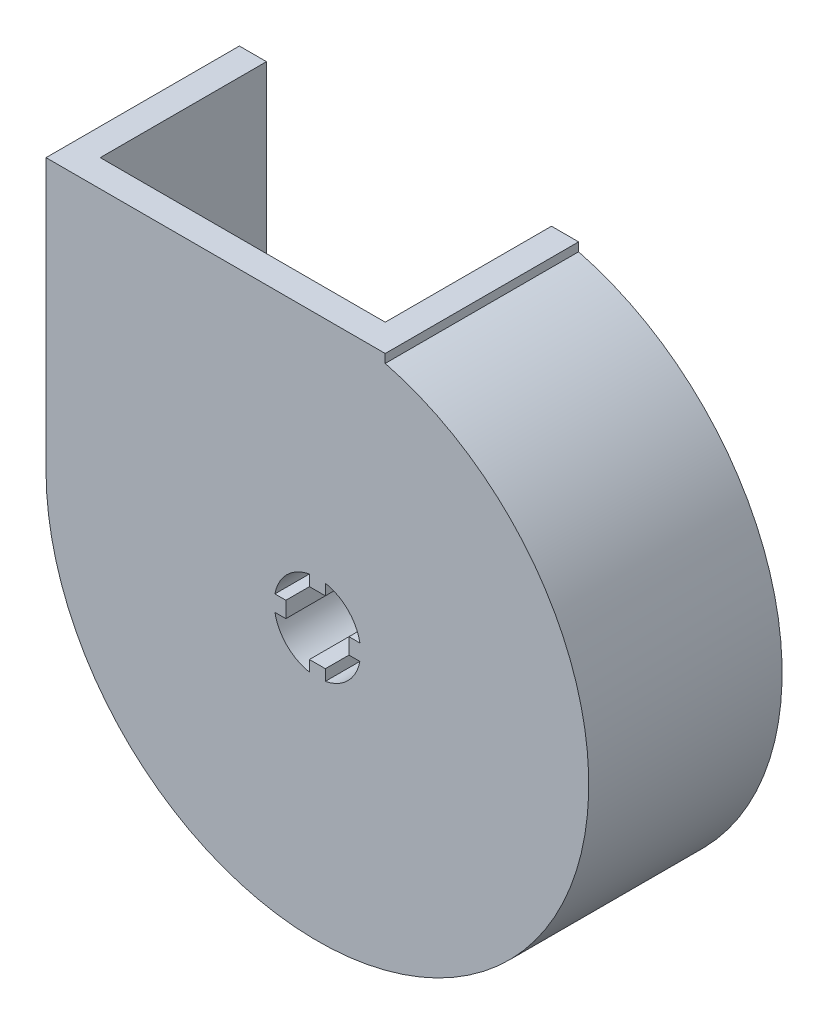
ISO-10303-21;
HEADER;
FILE_DESCRIPTION(('STEP AP214'),'2;1');
FILE_NAME('part.step','',(''),(''),'','','');
FILE_SCHEMA(('AUTOMOTIVE_DESIGN { 1 0 10303 214 1 1 1 1 }'));
ENDSEC;
DATA;
#1=APPLICATION_CONTEXT('core data for automotive mechanical design processes');
#2=APPLICATION_PROTOCOL_DEFINITION('international standard','automotive_design',2000,#1);
#3=PRODUCT_CONTEXT('',#1,'mechanical');
#4=PRODUCT('Part','Part','',(#3));
#5=PRODUCT_RELATED_PRODUCT_CATEGORY('part','',(#4));
#6=PRODUCT_DEFINITION_FORMATION('','',#4);
#7=PRODUCT_DEFINITION_CONTEXT('part definition',#1,'design');
#8=PRODUCT_DEFINITION('design','',#6,#7);
#9=PRODUCT_DEFINITION_SHAPE('','',#8);
#10=(LENGTH_UNIT() NAMED_UNIT(*) SI_UNIT(.MILLI.,.METRE.));
#11=(NAMED_UNIT(*) PLANE_ANGLE_UNIT() SI_UNIT($,.RADIAN.));
#12=(NAMED_UNIT(*) SI_UNIT($,.STERADIAN.) SOLID_ANGLE_UNIT());
#13=UNCERTAINTY_MEASURE_WITH_UNIT(LENGTH_MEASURE(1.E-05),#10,'distance_accuracy_value','');
#14=(GEOMETRIC_REPRESENTATION_CONTEXT(3) GLOBAL_UNCERTAINTY_ASSIGNED_CONTEXT((#13)) GLOBAL_UNIT_ASSIGNED_CONTEXT((#10,
#11,#12)) REPRESENTATION_CONTEXT('',''));
#15=CARTESIAN_POINT('',(0.,0.,0.));
#16=DIRECTION('',(0.,0.,1.));
#17=DIRECTION('',(1.,0.,0.));
#18=AXIS2_PLACEMENT_3D('',#15,#16,#17);
#19=CARTESIAN_POINT('',(0.,0.,0.));
#20=DIRECTION('',(0.,0.,-1.));
#21=DIRECTION('',(-1.,0.,0.));
#22=AXIS2_PLACEMENT_3D('',#19,#20,#21);
#23=PLANE('',#22);
#24=CARTESIAN_POINT('',(0.,0.,0.));
#25=DIRECTION('',(0.,0.,-1.));
#26=DIRECTION('',(-1.,0.,0.));
#27=AXIS2_PLACEMENT_3D('',#24,#25,#26);
#28=CIRCLE('',#27,72.01);
#29=CARTESIAN_POINT('',(12.01,71.0014084367346,0.));
#30=VERTEX_POINT('',#29);
#31=CARTESIAN_POINT('',(-72.01,0.,0.));
#32=VERTEX_POINT('',#31);
#33=EDGE_CURVE('E407',#30,#32,#28,.T.);
#34=ORIENTED_EDGE('',*,*,#33,.F.);
#35=DIRECTION('',(0.,-1.,0.));
#36=VECTOR('',#35,1.);
#37=CARTESIAN_POINT('',(12.01,0.,0.));
#38=LINE('',#37,#36);
#39=CARTESIAN_POINT('',(12.01,80.,0.));
#40=VERTEX_POINT('',#39);
#41=EDGE_CURVE('E404',#40,#30,#38,.T.);
#42=ORIENTED_EDGE('',*,*,#41,.F.);
#43=DIRECTION('',(-1.,0.,0.));
#44=VECTOR('',#43,1.);
#45=CARTESIAN_POINT('',(0.,80.,0.));
#46=LINE('',#45,#44);
#47=CARTESIAN_POINT('',(20.,80.,0.));
#48=VERTEX_POINT('',#47);
#49=EDGE_CURVE('E412',#48,#40,#46,.T.);
#50=ORIENTED_EDGE('',*,*,#49,.F.);
#51=DIRECTION('',(0.,-1.,0.));
#52=VECTOR('',#51,1.);
#53=CARTESIAN_POINT('',(20.,0.,0.));
#54=LINE('',#53,#52);
#55=CARTESIAN_POINT('',(20.,77.4596669241483,0.));
#56=VERTEX_POINT('',#55);
#57=EDGE_CURVE('E419',#48,#56,#54,.T.);
#58=ORIENTED_EDGE('',*,*,#57,.T.);
#59=CARTESIAN_POINT('',(0.,0.,0.));
#60=DIRECTION('',(0.,0.,-1.));
#61=DIRECTION('',(-1.,0.,0.));
#62=AXIS2_PLACEMENT_3D('',#59,#60,#61);
#63=CIRCLE('',#62,80.);
#64=CARTESIAN_POINT('',(-80.,0.,0.));
#65=VERTEX_POINT('',#64);
#66=EDGE_CURVE('E233',#56,#65,#63,.T.);
#67=ORIENTED_EDGE('',*,*,#66,.T.);
#68=DIRECTION('',(0.,-1.,0.));
#69=VECTOR('',#68,1.);
#70=CARTESIAN_POINT('',(-80.,0.,0.));
#71=LINE('',#70,#69);
#72=CARTESIAN_POINT('',(-80.,80.,0.));
#73=VERTEX_POINT('',#72);
#74=EDGE_CURVE('E330',#73,#65,#71,.T.);
#75=ORIENTED_EDGE('',*,*,#74,.F.);
#76=CARTESIAN_POINT('',(-72.01,80.,0.));
#77=VERTEX_POINT('',#76);
#78=EDGE_CURVE('E411',#77,#73,#46,.T.);
#79=ORIENTED_EDGE('',*,*,#78,.F.);
#80=DIRECTION('',(0.,-1.,0.));
#81=VECTOR('',#80,1.);
#82=CARTESIAN_POINT('',(-72.01,0.,0.));
#83=LINE('',#82,#81);
#84=EDGE_CURVE('E415',#77,#32,#83,.T.);
#85=ORIENTED_EDGE('',*,*,#84,.T.);
#86=EDGE_LOOP('',(#34,#42,#50,#58,#67,#75,#79,#85));
#87=FACE_BOUND('',#86,.T.);
#88=ADVANCED_FACE('F45',(#87),#23,.T.);
#89=CARTESIAN_POINT('',(0.,0.,0.));
#90=DIRECTION('',(0.,0.,-1.));
#91=DIRECTION('',(-1.,0.,0.));
#92=AXIS2_PLACEMENT_3D('',#89,#90,#91);
#93=CIRCLE('',#92,12.75);
#94=CARTESIAN_POINT('',(12.5315601582564,2.35,0.));
#95=VERTEX_POINT('',#94);
#96=CARTESIAN_POINT('',(2.35,12.5315601582564,0.));
#97=VERTEX_POINT('',#96);
#98=EDGE_CURVE('E231',#95,#97,#93,.F.);
#99=ORIENTED_EDGE('',*,*,#98,.T.);
#100=DIRECTION('',(0.,-1.,0.));
#101=VECTOR('',#100,1.);
#102=CARTESIAN_POINT('',(2.35,9.3,0.));
#103=LINE('',#102,#101);
#104=CARTESIAN_POINT('',(2.35,9.3,0.));
#105=VERTEX_POINT('',#104);
#106=EDGE_CURVE('E211',#97,#105,#103,.T.);
#107=ORIENTED_EDGE('',*,*,#106,.T.);
#108=DIRECTION('',(-1.,0.,0.));
#109=VECTOR('',#108,1.);
#110=CARTESIAN_POINT('',(-2.35,9.3,0.));
#111=LINE('',#110,#109);
#112=CARTESIAN_POINT('',(-2.35,9.3,0.));
#113=VERTEX_POINT('',#112);
#114=EDGE_CURVE('E228',#105,#113,#111,.T.);
#115=ORIENTED_EDGE('',*,*,#114,.T.);
#116=DIRECTION('',(0.,1.,0.));
#117=VECTOR('',#116,1.);
#118=CARTESIAN_POINT('',(-2.35,12.5315601582564,0.));
#119=LINE('',#118,#117);
#120=CARTESIAN_POINT('',(-2.35,12.5315601582564,0.));
#121=VERTEX_POINT('',#120);
#122=EDGE_CURVE('E238',#113,#121,#119,.T.);
#123=ORIENTED_EDGE('',*,*,#122,.T.);
#124=CARTESIAN_POINT('',(0.,0.,0.));
#125=DIRECTION('',(0.,0.,-1.));
#126=DIRECTION('',(-1.,0.,0.));
#127=AXIS2_PLACEMENT_3D('',#124,#125,#126);
#128=CIRCLE('',#127,12.75);
#129=CARTESIAN_POINT('',(-12.5315601582564,2.35,0.));
#130=VERTEX_POINT('',#129);
#131=EDGE_CURVE('E241',#121,#130,#128,.F.);
#132=ORIENTED_EDGE('',*,*,#131,.T.);
#133=DIRECTION('',(1.,0.,0.));
#134=VECTOR('',#133,1.);
#135=CARTESIAN_POINT('',(-9.3,2.35,0.));
#136=LINE('',#135,#134);
#137=CARTESIAN_POINT('',(-9.3,2.35,0.));
#138=VERTEX_POINT('',#137);
#139=EDGE_CURVE('E467',#130,#138,#136,.T.);
#140=ORIENTED_EDGE('',*,*,#139,.T.);
#141=DIRECTION('',(0.,-1.,0.));
#142=VECTOR('',#141,1.);
#143=CARTESIAN_POINT('',(-9.3,-2.35,0.));
#144=LINE('',#143,#142);
#145=CARTESIAN_POINT('',(-9.3,-2.35,0.));
#146=VERTEX_POINT('',#145);
#147=EDGE_CURVE('E463',#138,#146,#144,.T.);
#148=ORIENTED_EDGE('',*,*,#147,.T.);
#149=DIRECTION('',(-1.,0.,0.));
#150=VECTOR('',#149,1.);
#151=CARTESIAN_POINT('',(-12.5315601582564,-2.35,0.));
#152=LINE('',#151,#150);
#153=CARTESIAN_POINT('',(-12.5315601582564,-2.35,0.));
#154=VERTEX_POINT('',#153);
#155=EDGE_CURVE('E459',#146,#154,#152,.T.);
#156=ORIENTED_EDGE('',*,*,#155,.T.);
#157=CARTESIAN_POINT('',(0.,0.,0.));
#158=DIRECTION('',(0.,0.,-1.));
#159=DIRECTION('',(-1.,0.,0.));
#160=AXIS2_PLACEMENT_3D('',#157,#158,#159);
#161=CIRCLE('',#160,12.75);
#162=CARTESIAN_POINT('',(-2.35,-12.5315601582564,0.));
#163=VERTEX_POINT('',#162);
#164=EDGE_CURVE('E455',#154,#163,#161,.F.);
#165=ORIENTED_EDGE('',*,*,#164,.T.);
#166=DIRECTION('',(0.,1.,0.));
#167=VECTOR('',#166,1.);
#168=CARTESIAN_POINT('',(-2.35,-9.3,0.));
#169=LINE('',#168,#167);
#170=CARTESIAN_POINT('',(-2.35,-9.3,0.));
#171=VERTEX_POINT('',#170);
#172=EDGE_CURVE('E451',#163,#171,#169,.T.);
#173=ORIENTED_EDGE('',*,*,#172,.T.);
#174=DIRECTION('',(1.,0.,0.));
#175=VECTOR('',#174,1.);
#176=CARTESIAN_POINT('',(2.35,-9.3,0.));
#177=LINE('',#176,#175);
#178=CARTESIAN_POINT('',(2.35,-9.3,0.));
#179=VERTEX_POINT('',#178);
#180=EDGE_CURVE('E447',#171,#179,#177,.T.);
#181=ORIENTED_EDGE('',*,*,#180,.T.);
#182=DIRECTION('',(0.,-1.,0.));
#183=VECTOR('',#182,1.);
#184=CARTESIAN_POINT('',(2.35,-12.5315601582564,0.));
#185=LINE('',#184,#183);
#186=CARTESIAN_POINT('',(2.35,-12.5315601582564,0.));
#187=VERTEX_POINT('',#186);
#188=EDGE_CURVE('E443',#179,#187,#185,.T.);
#189=ORIENTED_EDGE('',*,*,#188,.T.);
#190=CARTESIAN_POINT('',(0.,0.,0.));
#191=DIRECTION('',(0.,0.,-1.));
#192=DIRECTION('',(-1.,0.,0.));
#193=AXIS2_PLACEMENT_3D('',#190,#191,#192);
#194=CIRCLE('',#193,12.75);
#195=CARTESIAN_POINT('',(12.5315601582564,-2.35,0.));
#196=VERTEX_POINT('',#195);
#197=EDGE_CURVE('E439',#187,#196,#194,.F.);
#198=ORIENTED_EDGE('',*,*,#197,.T.);
#199=DIRECTION('',(-1.,0.,0.));
#200=VECTOR('',#199,1.);
#201=CARTESIAN_POINT('',(9.3,-2.35,0.));
#202=LINE('',#201,#200);
#203=CARTESIAN_POINT('',(9.3,-2.35,0.));
#204=VERTEX_POINT('',#203);
#205=EDGE_CURVE('E435',#196,#204,#202,.T.);
#206=ORIENTED_EDGE('',*,*,#205,.T.);
#207=DIRECTION('',(0.,1.,0.));
#208=VECTOR('',#207,1.);
#209=CARTESIAN_POINT('',(9.3,2.35,0.));
#210=LINE('',#209,#208);
#211=CARTESIAN_POINT('',(9.3,2.35,0.));
#212=VERTEX_POINT('',#211);
#213=EDGE_CURVE('E431',#204,#212,#210,.T.);
#214=ORIENTED_EDGE('',*,*,#213,.T.);
#215=DIRECTION('',(1.,0.,0.));
#216=VECTOR('',#215,1.);
#217=CARTESIAN_POINT('',(12.5315601582564,2.35,0.));
#218=LINE('',#217,#216);
#219=EDGE_CURVE('E428',#212,#95,#218,.T.);
#220=ORIENTED_EDGE('',*,*,#219,.T.);
#221=EDGE_LOOP('',(#99,#107,#115,#123,#132,#140,#148,#156,#165,#173,#181,#189,#198,#206,#214,#220));
#222=FACE_BOUND('',#221,.T.);
#223=CARTESIAN_POINT('',(0.,0.,0.));
#224=DIRECTION('',(0.,0.,-1.));
#225=DIRECTION('',(-1.,0.,0.));
#226=AXIS2_PLACEMENT_3D('',#223,#224,#225);
#227=CIRCLE('',#226,20.74);
#228=CARTESIAN_POINT('',(-20.74,0.,0.));
#229=VERTEX_POINT('',#228);
#230=EDGE_CURVE('E400',#229,#229,#227,.F.);
#231=ORIENTED_EDGE('',*,*,#230,.F.);
#232=EDGE_LOOP('',(#231));
#233=FACE_BOUND('',#232,.T.);
#234=ADVANCED_FACE('F225',(#222,#233),#23,.T.);
#235=CARTESIAN_POINT('',(0.,80.,0.));
#236=DIRECTION('',(0.,1.,0.));
#237=DIRECTION('',(0.,0.,1.));
#238=AXIS2_PLACEMENT_3D('',#235,#236,#237);
#239=PLANE('',#238);
#240=DIRECTION('',(0.,0.,-1.));
#241=VECTOR('',#240,1.);
#242=CARTESIAN_POINT('',(20.,80.,105.));
#243=LINE('',#242,#241);
#244=CARTESIAN_POINT('',(20.,80.,57.));
#245=VERTEX_POINT('',#244);
#246=EDGE_CURVE('E313',#245,#48,#243,.T.);
#247=ORIENTED_EDGE('',*,*,#246,.T.);
#248=ORIENTED_EDGE('',*,*,#49,.T.);
#249=DIRECTION('',(0.,0.,-1.));
#250=VECTOR('',#249,1.);
#251=CARTESIAN_POINT('',(12.01,80.,105.));
#252=LINE('',#251,#250);
#253=CARTESIAN_POINT('',(12.01,80.,49.01));
#254=VERTEX_POINT('',#253);
#255=EDGE_CURVE('E306',#254,#40,#252,.T.);
#256=ORIENTED_EDGE('',*,*,#255,.F.);
#257=DIRECTION('',(1.,0.,0.));
#258=VECTOR('',#257,1.);
#259=CARTESIAN_POINT('',(-105.,80.,49.01));
#260=LINE('',#259,#258);
#261=CARTESIAN_POINT('',(-72.01,80.,49.01));
#262=VERTEX_POINT('',#261);
#263=EDGE_CURVE('E311',#262,#254,#260,.T.);
#264=ORIENTED_EDGE('',*,*,#263,.F.);
#265=DIRECTION('',(0.,0.,-1.));
#266=VECTOR('',#265,1.);
#267=CARTESIAN_POINT('',(-72.01,80.,105.));
#268=LINE('',#267,#266);
#269=EDGE_CURVE('E11',#262,#77,#268,.T.);
#270=ORIENTED_EDGE('',*,*,#269,.T.);
#271=ORIENTED_EDGE('',*,*,#78,.T.);
#272=DIRECTION('',(0.,0.,-1.));
#273=VECTOR('',#272,1.);
#274=CARTESIAN_POINT('',(-80.,80.,105.));
#275=LINE('',#274,#273);
#276=CARTESIAN_POINT('',(-80.,80.,57.));
#277=VERTEX_POINT('',#276);
#278=EDGE_CURVE('E310',#277,#73,#275,.T.);
#279=ORIENTED_EDGE('',*,*,#278,.F.);
#280=DIRECTION('',(1.,0.,0.));
#281=VECTOR('',#280,1.);
#282=CARTESIAN_POINT('',(-105.,80.,57.));
#283=LINE('',#282,#281);
#284=EDGE_CURVE('E54',#277,#245,#283,.T.);
#285=ORIENTED_EDGE('',*,*,#284,.T.);
#286=EDGE_LOOP('',(#247,#248,#256,#264,#270,#271,#279,#285));
#287=FACE_BOUND('',#286,.T.);
#288=ADVANCED_FACE('F538',(#287),#239,.T.);
#289=CARTESIAN_POINT('',(0.,0.,105.));
#290=DIRECTION('',(0.,0.,-1.));
#291=DIRECTION('',(-1.,0.,0.));
#292=AXIS2_PLACEMENT_3D('',#289,#290,#291);
#293=CYLINDRICAL_SURFACE('',#292,72.01);
#294=DIRECTION('',(0.,0.,-1.));
#295=VECTOR('',#294,1.);
#296=CARTESIAN_POINT('',(12.01,71.0014084367346,49.01));
#297=LINE('',#296,#295);
#298=CARTESIAN_POINT('',(12.01,71.0014084367346,49.01));
#299=VERTEX_POINT('',#298);
#300=EDGE_CURVE('E301',#299,#30,#297,.T.);
#301=ORIENTED_EDGE('',*,*,#300,.T.);
#302=ORIENTED_EDGE('',*,*,#33,.T.);
#303=DIRECTION('',(0.,0.,-1.));
#304=VECTOR('',#303,1.);
#305=CARTESIAN_POINT('',(-72.01,0.,105.));
#306=LINE('',#305,#304);
#307=CARTESIAN_POINT('',(-72.01,0.,49.01));
#308=VERTEX_POINT('',#307);
#309=EDGE_CURVE('E296',#308,#32,#306,.T.);
#310=ORIENTED_EDGE('',*,*,#309,.F.);
#311=CARTESIAN_POINT('',(0.,0.,49.01));
#312=DIRECTION('',(0.,0.,-1.));
#313=DIRECTION('',(0.,1.,0.));
#314=AXIS2_PLACEMENT_3D('',#311,#312,#313);
#315=CIRCLE('',#314,72.01);
#316=EDGE_CURVE('E300',#299,#308,#315,.T.);
#317=ORIENTED_EDGE('',*,*,#316,.F.);
#318=EDGE_LOOP('',(#301,#302,#310,#317));
#319=FACE_BOUND('',#318,.T.);
#320=ADVANCED_FACE('F540',(#319),#293,.F.);
#321=CARTESIAN_POINT('',(12.01,0.,105.));
#322=DIRECTION('',(-1.,0.,0.));
#323=DIRECTION('',(0.,0.,1.));
#324=AXIS2_PLACEMENT_3D('',#321,#322,#323);
#325=PLANE('',#324);
#326=ORIENTED_EDGE('',*,*,#255,.T.);
#327=ORIENTED_EDGE('',*,*,#41,.T.);
#328=ORIENTED_EDGE('',*,*,#300,.F.);
#329=DIRECTION('',(0.,-1.,0.));
#330=VECTOR('',#329,1.);
#331=CARTESIAN_POINT('',(12.01,0.,49.01));
#332=LINE('',#331,#330);
#333=EDGE_CURVE('E299',#254,#299,#332,.T.);
#334=ORIENTED_EDGE('',*,*,#333,.F.);
#335=EDGE_LOOP('',(#326,#327,#328,#334));
#336=FACE_BOUND('',#335,.T.);
#337=ADVANCED_FACE('F47',(#336),#325,.T.);
#338=CARTESIAN_POINT('',(-72.01,0.,105.));
#339=DIRECTION('',(-1.,0.,0.));
#340=DIRECTION('',(0.,0.,1.));
#341=AXIS2_PLACEMENT_3D('',#338,#339,#340);
#342=PLANE('',#341);
#343=ORIENTED_EDGE('',*,*,#84,.F.);
#344=ORIENTED_EDGE('',*,*,#269,.F.);
#345=DIRECTION('',(0.,-1.,0.));
#346=VECTOR('',#345,1.);
#347=CARTESIAN_POINT('',(-72.01,0.,49.01));
#348=LINE('',#347,#346);
#349=EDGE_CURVE('E305',#262,#308,#348,.T.);
#350=ORIENTED_EDGE('',*,*,#349,.T.);
#351=ORIENTED_EDGE('',*,*,#309,.T.);
#352=EDGE_LOOP('',(#343,#344,#350,#351));
#353=FACE_BOUND('',#352,.T.);
#354=ADVANCED_FACE('F628',(#353),#342,.F.);
#355=CARTESIAN_POINT('',(0.,0.,-105.));
#356=DIRECTION('',(0.,0.,1.));
#357=DIRECTION('',(1.,0.,0.));
#358=AXIS2_PLACEMENT_3D('',#355,#356,#357);
#359=CYLINDRICAL_SURFACE('',#358,20.74);
#360=CARTESIAN_POINT('',(0.,0.,49.01));
#361=DIRECTION('',(0.,0.,-1.));
#362=DIRECTION('',(0.,1.,0.));
#363=AXIS2_PLACEMENT_3D('',#360,#361,#362);
#364=CIRCLE('',#363,20.74);
#365=CARTESIAN_POINT('',(0.,20.74,49.01));
#366=VERTEX_POINT('',#365);
#367=EDGE_CURVE('E326',#366,#366,#364,.F.);
#368=ORIENTED_EDGE('',*,*,#367,.F.);
#369=EDGE_LOOP('',(#368));
#370=FACE_BOUND('',#369,.T.);
#371=ORIENTED_EDGE('',*,*,#230,.T.);
#372=EDGE_LOOP('',(#371));
#373=FACE_BOUND('',#372,.T.);
#374=ADVANCED_FACE('F622',(#370,#373),#359,.T.);
#375=CARTESIAN_POINT('',(-80.,0.,105.));
#376=DIRECTION('',(-1.,0.,0.));
#377=DIRECTION('',(0.,0.,1.));
#378=AXIS2_PLACEMENT_3D('',#375,#376,#377);
#379=PLANE('',#378);
#380=ORIENTED_EDGE('',*,*,#278,.T.);
#381=ORIENTED_EDGE('',*,*,#74,.T.);
#382=DIRECTION('',(0.,0.,-1.));
#383=VECTOR('',#382,1.);
#384=CARTESIAN_POINT('',(-80.,0.,105.));
#385=LINE('',#384,#383);
#386=CARTESIAN_POINT('',(-80.,0.,57.));
#387=VERTEX_POINT('',#386);
#388=EDGE_CURVE('E293',#387,#65,#385,.T.);
#389=ORIENTED_EDGE('',*,*,#388,.F.);
#390=DIRECTION('',(0.,-1.,0.));
#391=VECTOR('',#390,1.);
#392=CARTESIAN_POINT('',(-80.,0.,57.));
#393=LINE('',#392,#391);
#394=EDGE_CURVE('E61',#277,#387,#393,.T.);
#395=ORIENTED_EDGE('',*,*,#394,.F.);
#396=EDGE_LOOP('',(#380,#381,#389,#395));
#397=FACE_BOUND('',#396,.T.);
#398=ADVANCED_FACE('F627',(#397),#379,.T.);
#399=CARTESIAN_POINT('',(20.,0.,105.));
#400=DIRECTION('',(-1.,0.,0.));
#401=DIRECTION('',(0.,0.,1.));
#402=AXIS2_PLACEMENT_3D('',#399,#400,#401);
#403=PLANE('',#402);
#404=ORIENTED_EDGE('',*,*,#57,.F.);
#405=ORIENTED_EDGE('',*,*,#246,.F.);
#406=DIRECTION('',(0.,-1.,0.));
#407=VECTOR('',#406,1.);
#408=CARTESIAN_POINT('',(20.,0.,57.));
#409=LINE('',#408,#407);
#410=CARTESIAN_POINT('',(20.,77.4596669241483,57.));
#411=VERTEX_POINT('',#410);
#412=EDGE_CURVE('E69',#245,#411,#409,.T.);
#413=ORIENTED_EDGE('',*,*,#412,.T.);
#414=DIRECTION('',(0.,0.,-1.));
#415=VECTOR('',#414,1.);
#416=CARTESIAN_POINT('',(20.,77.4596669241483,105.));
#417=LINE('',#416,#415);
#418=EDGE_CURVE('E290',#411,#56,#417,.T.);
#419=ORIENTED_EDGE('',*,*,#418,.T.);
#420=EDGE_LOOP('',(#404,#405,#413,#419));
#421=FACE_BOUND('',#420,.T.);
#422=ADVANCED_FACE('F638',(#421),#403,.F.);
#423=CARTESIAN_POINT('',(0.,0.,105.));
#424=DIRECTION('',(0.,0.,-1.));
#425=DIRECTION('',(-1.,0.,0.));
#426=AXIS2_PLACEMENT_3D('',#423,#424,#425);
#427=CYLINDRICAL_SURFACE('',#426,80.);
#428=ORIENTED_EDGE('',*,*,#66,.F.);
#429=ORIENTED_EDGE('',*,*,#418,.F.);
#430=CARTESIAN_POINT('',(0.,0.,57.));
#431=DIRECTION('',(0.,0.,-1.));
#432=DIRECTION('',(0.,1.,0.));
#433=AXIS2_PLACEMENT_3D('',#430,#431,#432);
#434=CIRCLE('',#433,80.);
#435=EDGE_CURVE('E289',#411,#387,#434,.T.);
#436=ORIENTED_EDGE('',*,*,#435,.T.);
#437=ORIENTED_EDGE('',*,*,#388,.T.);
#438=EDGE_LOOP('',(#428,#429,#436,#437));
#439=FACE_BOUND('',#438,.T.);
#440=ADVANCED_FACE('F664',(#439),#427,.T.);
#441=CARTESIAN_POINT('',(2.35,9.3,-105.));
#442=DIRECTION('',(-1.,0.,0.));
#443=DIRECTION('',(0.,-1.,0.));
#444=AXIS2_PLACEMENT_3D('',#441,#442,#443);
#445=PLANE('',#444);
#446=ORIENTED_EDGE('',*,*,#106,.F.);
#447=DIRECTION('',(0.,0.,1.));
#448=VECTOR('',#447,1.);
#449=CARTESIAN_POINT('',(2.35,12.5315601582564,-105.));
#450=LINE('',#449,#448);
#451=CARTESIAN_POINT('',(2.35,12.5315601582564,57.));
#452=VERTEX_POINT('',#451);
#453=EDGE_CURVE('E286',#97,#452,#450,.T.);
#454=ORIENTED_EDGE('',*,*,#453,.T.);
#455=DIRECTION('',(0.,-1.,0.));
#456=VECTOR('',#455,1.);
#457=CARTESIAN_POINT('',(2.35,9.3,57.));
#458=LINE('',#457,#456);
#459=CARTESIAN_POINT('',(2.35,9.3,57.));
#460=VERTEX_POINT('',#459);
#461=EDGE_CURVE('E214',#452,#460,#458,.T.);
#462=ORIENTED_EDGE('',*,*,#461,.T.);
#463=DIRECTION('',(0.,0.,1.));
#464=VECTOR('',#463,1.);
#465=CARTESIAN_POINT('',(2.35,9.3,-105.));
#466=LINE('',#465,#464);
#467=EDGE_CURVE('E208',#105,#460,#466,.T.);
#468=ORIENTED_EDGE('',*,*,#467,.F.);
#469=EDGE_LOOP('',(#446,#454,#462,#468));
#470=FACE_BOUND('',#469,.T.);
#471=ADVANCED_FACE('F210',(#470),#445,.F.);
#472=CARTESIAN_POINT('',(0.,0.,-105.));
#473=DIRECTION('',(0.,0.,1.));
#474=DIRECTION('',(1.,0.,0.));
#475=AXIS2_PLACEMENT_3D('',#472,#473,#474);
#476=CYLINDRICAL_SURFACE('',#475,12.75);
#477=ORIENTED_EDGE('',*,*,#98,.F.);
#478=DIRECTION('',(0.,0.,1.));
#479=VECTOR('',#478,1.);
#480=CARTESIAN_POINT('',(12.5315601582564,2.35,-105.));
#481=LINE('',#480,#479);
#482=CARTESIAN_POINT('',(12.5315601582564,2.35,57.));
#483=VERTEX_POINT('',#482);
#484=EDGE_CURVE('E283',#95,#483,#481,.T.);
#485=ORIENTED_EDGE('',*,*,#484,.T.);
#486=CARTESIAN_POINT('',(0.,0.,57.));
#487=DIRECTION('',(0.,0.,1.));
#488=DIRECTION('',(1.,0.,0.));
#489=AXIS2_PLACEMENT_3D('',#486,#487,#488);
#490=CIRCLE('',#489,12.75);
#491=EDGE_CURVE('E221',#483,#452,#490,.T.);
#492=ORIENTED_EDGE('',*,*,#491,.T.);
#493=ORIENTED_EDGE('',*,*,#453,.F.);
#494=EDGE_LOOP('',(#477,#485,#492,#493));
#495=FACE_BOUND('',#494,.T.);
#496=ADVANCED_FACE('F522',(#495),#476,.F.);
#497=CARTESIAN_POINT('',(12.5315601582564,2.35,-105.));
#498=DIRECTION('',(0.,-1.,0.));
#499=DIRECTION('',(1.,0.,0.));
#500=AXIS2_PLACEMENT_3D('',#497,#498,#499);
#501=PLANE('',#500);
#502=ORIENTED_EDGE('',*,*,#219,.F.);
#503=DIRECTION('',(0.,0.,1.));
#504=VECTOR('',#503,1.);
#505=CARTESIAN_POINT('',(9.3,2.35,-105.));
#506=LINE('',#505,#504);
#507=CARTESIAN_POINT('',(9.3,2.35,57.));
#508=VERTEX_POINT('',#507);
#509=EDGE_CURVE('E280',#212,#508,#506,.T.);
#510=ORIENTED_EDGE('',*,*,#509,.T.);
#511=DIRECTION('',(1.,0.,0.));
#512=VECTOR('',#511,1.);
#513=CARTESIAN_POINT('',(12.5315601582564,2.35,57.));
#514=LINE('',#513,#512);
#515=EDGE_CURVE('E381',#508,#483,#514,.T.);
#516=ORIENTED_EDGE('',*,*,#515,.T.);
#517=ORIENTED_EDGE('',*,*,#484,.F.);
#518=EDGE_LOOP('',(#502,#510,#516,#517));
#519=FACE_BOUND('',#518,.T.);
#520=ADVANCED_FACE('F519',(#519),#501,.F.);
#521=CARTESIAN_POINT('',(9.3,2.35,-105.));
#522=DIRECTION('',(1.,0.,0.));
#523=DIRECTION('',(0.,0.,-1.));
#524=AXIS2_PLACEMENT_3D('',#521,#522,#523);
#525=PLANE('',#524);
#526=ORIENTED_EDGE('',*,*,#213,.F.);
#527=DIRECTION('',(0.,0.,1.));
#528=VECTOR('',#527,1.);
#529=CARTESIAN_POINT('',(9.3,-2.35,-105.));
#530=LINE('',#529,#528);
#531=CARTESIAN_POINT('',(9.3,-2.35,57.));
#532=VERTEX_POINT('',#531);
#533=EDGE_CURVE('E277',#204,#532,#530,.T.);
#534=ORIENTED_EDGE('',*,*,#533,.T.);
#535=DIRECTION('',(0.,1.,0.));
#536=VECTOR('',#535,1.);
#537=CARTESIAN_POINT('',(9.3,2.35,57.));
#538=LINE('',#537,#536);
#539=EDGE_CURVE('E377',#532,#508,#538,.T.);
#540=ORIENTED_EDGE('',*,*,#539,.T.);
#541=ORIENTED_EDGE('',*,*,#509,.F.);
#542=EDGE_LOOP('',(#526,#534,#540,#541));
#543=FACE_BOUND('',#542,.T.);
#544=ADVANCED_FACE('F515',(#543),#525,.F.);
#545=CARTESIAN_POINT('',(9.3,-2.35,-105.));
#546=DIRECTION('',(0.,1.,0.));
#547=DIRECTION('',(-1.,0.,0.));
#548=AXIS2_PLACEMENT_3D('',#545,#546,#547);
#549=PLANE('',#548);
#550=ORIENTED_EDGE('',*,*,#205,.F.);
#551=DIRECTION('',(0.,0.,1.));
#552=VECTOR('',#551,1.);
#553=CARTESIAN_POINT('',(12.5315601582564,-2.35,-105.));
#554=LINE('',#553,#552);
#555=CARTESIAN_POINT('',(12.5315601582564,-2.35,57.));
#556=VERTEX_POINT('',#555);
#557=EDGE_CURVE('E274',#196,#556,#554,.T.);
#558=ORIENTED_EDGE('',*,*,#557,.T.);
#559=DIRECTION('',(-1.,0.,0.));
#560=VECTOR('',#559,1.);
#561=CARTESIAN_POINT('',(9.3,-2.35,57.));
#562=LINE('',#561,#560);
#563=EDGE_CURVE('E373',#556,#532,#562,.T.);
#564=ORIENTED_EDGE('',*,*,#563,.T.);
#565=ORIENTED_EDGE('',*,*,#533,.F.);
#566=EDGE_LOOP('',(#550,#558,#564,#565));
#567=FACE_BOUND('',#566,.T.);
#568=ADVANCED_FACE('F511',(#567),#549,.F.);
#569=CARTESIAN_POINT('',(0.,0.,-105.));
#570=DIRECTION('',(0.,0.,1.));
#571=DIRECTION('',(1.,0.,0.));
#572=AXIS2_PLACEMENT_3D('',#569,#570,#571);
#573=CYLINDRICAL_SURFACE('',#572,12.75);
#574=ORIENTED_EDGE('',*,*,#197,.F.);
#575=DIRECTION('',(0.,0.,1.));
#576=VECTOR('',#575,1.);
#577=CARTESIAN_POINT('',(2.35,-12.5315601582564,-105.));
#578=LINE('',#577,#576);
#579=CARTESIAN_POINT('',(2.35,-12.5315601582564,57.));
#580=VERTEX_POINT('',#579);
#581=EDGE_CURVE('E271',#187,#580,#578,.T.);
#582=ORIENTED_EDGE('',*,*,#581,.T.);
#583=CARTESIAN_POINT('',(0.,0.,57.));
#584=DIRECTION('',(0.,0.,1.));
#585=DIRECTION('',(1.,0.,0.));
#586=AXIS2_PLACEMENT_3D('',#583,#584,#585);
#587=CIRCLE('',#586,12.75);
#588=EDGE_CURVE('E369',#580,#556,#587,.T.);
#589=ORIENTED_EDGE('',*,*,#588,.T.);
#590=ORIENTED_EDGE('',*,*,#557,.F.);
#591=EDGE_LOOP('',(#574,#582,#589,#590));
#592=FACE_BOUND('',#591,.T.);
#593=ADVANCED_FACE('F507',(#592),#573,.F.);
#594=CARTESIAN_POINT('',(2.35,-12.5315601582564,-105.));
#595=DIRECTION('',(-1.,0.,0.));
#596=DIRECTION('',(0.,-1.,0.));
#597=AXIS2_PLACEMENT_3D('',#594,#595,#596);
#598=PLANE('',#597);
#599=ORIENTED_EDGE('',*,*,#188,.F.);
#600=DIRECTION('',(0.,0.,1.));
#601=VECTOR('',#600,1.);
#602=CARTESIAN_POINT('',(2.35,-9.3,-105.));
#603=LINE('',#602,#601);
#604=CARTESIAN_POINT('',(2.35,-9.3,57.));
#605=VERTEX_POINT('',#604);
#606=EDGE_CURVE('E268',#179,#605,#603,.T.);
#607=ORIENTED_EDGE('',*,*,#606,.T.);
#608=DIRECTION('',(0.,-1.,0.));
#609=VECTOR('',#608,1.);
#610=CARTESIAN_POINT('',(2.35,-12.5315601582564,57.));
#611=LINE('',#610,#609);
#612=EDGE_CURVE('E365',#605,#580,#611,.T.);
#613=ORIENTED_EDGE('',*,*,#612,.T.);
#614=ORIENTED_EDGE('',*,*,#581,.F.);
#615=EDGE_LOOP('',(#599,#607,#613,#614));
#616=FACE_BOUND('',#615,.T.);
#617=ADVANCED_FACE('F503',(#616),#598,.F.);
#618=CARTESIAN_POINT('',(2.35,-9.3,-105.));
#619=DIRECTION('',(0.,-1.,0.));
#620=DIRECTION('',(0.,0.,-1.));
#621=AXIS2_PLACEMENT_3D('',#618,#619,#620);
#622=PLANE('',#621);
#623=ORIENTED_EDGE('',*,*,#180,.F.);
#624=DIRECTION('',(0.,0.,1.));
#625=VECTOR('',#624,1.);
#626=CARTESIAN_POINT('',(-2.35,-9.3,-105.));
#627=LINE('',#626,#625);
#628=CARTESIAN_POINT('',(-2.35,-9.3,57.));
#629=VERTEX_POINT('',#628);
#630=EDGE_CURVE('E265',#171,#629,#627,.T.);
#631=ORIENTED_EDGE('',*,*,#630,.T.);
#632=DIRECTION('',(1.,0.,0.));
#633=VECTOR('',#632,1.);
#634=CARTESIAN_POINT('',(2.35,-9.3,57.));
#635=LINE('',#634,#633);
#636=EDGE_CURVE('E361',#629,#605,#635,.T.);
#637=ORIENTED_EDGE('',*,*,#636,.T.);
#638=ORIENTED_EDGE('',*,*,#606,.F.);
#639=EDGE_LOOP('',(#623,#631,#637,#638));
#640=FACE_BOUND('',#639,.T.);
#641=ADVANCED_FACE('F499',(#640),#622,.F.);
#642=CARTESIAN_POINT('',(-2.35,-9.3,-105.));
#643=DIRECTION('',(1.,0.,0.));
#644=DIRECTION('',(0.,1.,0.));
#645=AXIS2_PLACEMENT_3D('',#642,#643,#644);
#646=PLANE('',#645);
#647=ORIENTED_EDGE('',*,*,#172,.F.);
#648=DIRECTION('',(0.,0.,1.));
#649=VECTOR('',#648,1.);
#650=CARTESIAN_POINT('',(-2.35,-12.5315601582564,-105.));
#651=LINE('',#650,#649);
#652=CARTESIAN_POINT('',(-2.35,-12.5315601582564,57.));
#653=VERTEX_POINT('',#652);
#654=EDGE_CURVE('E262',#163,#653,#651,.T.);
#655=ORIENTED_EDGE('',*,*,#654,.T.);
#656=DIRECTION('',(0.,1.,0.));
#657=VECTOR('',#656,1.);
#658=CARTESIAN_POINT('',(-2.35,-9.3,57.));
#659=LINE('',#658,#657);
#660=EDGE_CURVE('E357',#653,#629,#659,.T.);
#661=ORIENTED_EDGE('',*,*,#660,.T.);
#662=ORIENTED_EDGE('',*,*,#630,.F.);
#663=EDGE_LOOP('',(#647,#655,#661,#662));
#664=FACE_BOUND('',#663,.T.);
#665=ADVANCED_FACE('F495',(#664),#646,.F.);
#666=CARTESIAN_POINT('',(0.,0.,-105.));
#667=DIRECTION('',(0.,0.,1.));
#668=DIRECTION('',(1.,0.,0.));
#669=AXIS2_PLACEMENT_3D('',#666,#667,#668);
#670=CYLINDRICAL_SURFACE('',#669,12.75);
#671=ORIENTED_EDGE('',*,*,#164,.F.);
#672=DIRECTION('',(0.,0.,1.));
#673=VECTOR('',#672,1.);
#674=CARTESIAN_POINT('',(-12.5315601582564,-2.35,-105.));
#675=LINE('',#674,#673);
#676=CARTESIAN_POINT('',(-12.5315601582564,-2.35,57.));
#677=VERTEX_POINT('',#676);
#678=EDGE_CURVE('E259',#154,#677,#675,.T.);
#679=ORIENTED_EDGE('',*,*,#678,.T.);
#680=CARTESIAN_POINT('',(0.,0.,57.));
#681=DIRECTION('',(0.,0.,1.));
#682=DIRECTION('',(1.,0.,0.));
#683=AXIS2_PLACEMENT_3D('',#680,#681,#682);
#684=CIRCLE('',#683,12.75);
#685=EDGE_CURVE('E353',#677,#653,#684,.T.);
#686=ORIENTED_EDGE('',*,*,#685,.T.);
#687=ORIENTED_EDGE('',*,*,#654,.F.);
#688=EDGE_LOOP('',(#671,#679,#686,#687));
#689=FACE_BOUND('',#688,.T.);
#690=ADVANCED_FACE('F491',(#689),#670,.F.);
#691=CARTESIAN_POINT('',(-12.5315601582564,-2.35,-105.));
#692=DIRECTION('',(0.,1.,0.));
#693=DIRECTION('',(-1.,0.,0.));
#694=AXIS2_PLACEMENT_3D('',#691,#692,#693);
#695=PLANE('',#694);
#696=ORIENTED_EDGE('',*,*,#155,.F.);
#697=DIRECTION('',(0.,0.,1.));
#698=VECTOR('',#697,1.);
#699=CARTESIAN_POINT('',(-9.3,-2.35,-105.));
#700=LINE('',#699,#698);
#701=CARTESIAN_POINT('',(-9.3,-2.35,57.));
#702=VERTEX_POINT('',#701);
#703=EDGE_CURVE('E256',#146,#702,#700,.T.);
#704=ORIENTED_EDGE('',*,*,#703,.T.);
#705=DIRECTION('',(-1.,0.,0.));
#706=VECTOR('',#705,1.);
#707=CARTESIAN_POINT('',(-12.5315601582564,-2.35,57.));
#708=LINE('',#707,#706);
#709=EDGE_CURVE('E349',#702,#677,#708,.T.);
#710=ORIENTED_EDGE('',*,*,#709,.T.);
#711=ORIENTED_EDGE('',*,*,#678,.F.);
#712=EDGE_LOOP('',(#696,#704,#710,#711));
#713=FACE_BOUND('',#712,.T.);
#714=ADVANCED_FACE('F487',(#713),#695,.F.);
#715=CARTESIAN_POINT('',(-9.3,-2.35,-105.));
#716=DIRECTION('',(-1.,0.,0.));
#717=DIRECTION('',(0.,0.,1.));
#718=AXIS2_PLACEMENT_3D('',#715,#716,#717);
#719=PLANE('',#718);
#720=ORIENTED_EDGE('',*,*,#147,.F.);
#721=DIRECTION('',(0.,0.,1.));
#722=VECTOR('',#721,1.);
#723=CARTESIAN_POINT('',(-9.3,2.35,-105.));
#724=LINE('',#723,#722);
#725=CARTESIAN_POINT('',(-9.3,2.35,57.));
#726=VERTEX_POINT('',#725);
#727=EDGE_CURVE('E253',#138,#726,#724,.T.);
#728=ORIENTED_EDGE('',*,*,#727,.T.);
#729=DIRECTION('',(0.,-1.,0.));
#730=VECTOR('',#729,1.);
#731=CARTESIAN_POINT('',(-9.3,-2.35,57.));
#732=LINE('',#731,#730);
#733=EDGE_CURVE('E345',#726,#702,#732,.T.);
#734=ORIENTED_EDGE('',*,*,#733,.T.);
#735=ORIENTED_EDGE('',*,*,#703,.F.);
#736=EDGE_LOOP('',(#720,#728,#734,#735));
#737=FACE_BOUND('',#736,.T.);
#738=ADVANCED_FACE('F483',(#737),#719,.F.);
#739=CARTESIAN_POINT('',(-9.3,2.35,-105.));
#740=DIRECTION('',(0.,-1.,0.));
#741=DIRECTION('',(1.,0.,0.));
#742=AXIS2_PLACEMENT_3D('',#739,#740,#741);
#743=PLANE('',#742);
#744=ORIENTED_EDGE('',*,*,#139,.F.);
#745=DIRECTION('',(0.,0.,1.));
#746=VECTOR('',#745,1.);
#747=CARTESIAN_POINT('',(-12.5315601582564,2.35,-105.));
#748=LINE('',#747,#746);
#749=CARTESIAN_POINT('',(-12.5315601582564,2.35,57.));
#750=VERTEX_POINT('',#749);
#751=EDGE_CURVE('E250',#130,#750,#748,.T.);
#752=ORIENTED_EDGE('',*,*,#751,.T.);
#753=DIRECTION('',(1.,0.,0.));
#754=VECTOR('',#753,1.);
#755=CARTESIAN_POINT('',(-9.3,2.35,57.));
#756=LINE('',#755,#754);
#757=EDGE_CURVE('E341',#750,#726,#756,.T.);
#758=ORIENTED_EDGE('',*,*,#757,.T.);
#759=ORIENTED_EDGE('',*,*,#727,.F.);
#760=EDGE_LOOP('',(#744,#752,#758,#759));
#761=FACE_BOUND('',#760,.T.);
#762=ADVANCED_FACE('F479',(#761),#743,.F.);
#763=CARTESIAN_POINT('',(0.,0.,-105.));
#764=DIRECTION('',(0.,0.,1.));
#765=DIRECTION('',(1.,0.,0.));
#766=AXIS2_PLACEMENT_3D('',#763,#764,#765);
#767=CYLINDRICAL_SURFACE('',#766,12.75);
#768=ORIENTED_EDGE('',*,*,#131,.F.);
#769=DIRECTION('',(0.,0.,1.));
#770=VECTOR('',#769,1.);
#771=CARTESIAN_POINT('',(-2.35,12.5315601582564,-105.));
#772=LINE('',#771,#770);
#773=CARTESIAN_POINT('',(-2.35,12.5315601582564,57.));
#774=VERTEX_POINT('',#773);
#775=EDGE_CURVE('E247',#121,#774,#772,.T.);
#776=ORIENTED_EDGE('',*,*,#775,.T.);
#777=CARTESIAN_POINT('',(0.,0.,57.));
#778=DIRECTION('',(0.,0.,1.));
#779=DIRECTION('',(1.,0.,0.));
#780=AXIS2_PLACEMENT_3D('',#777,#778,#779);
#781=CIRCLE('',#780,12.75);
#782=EDGE_CURVE('E337',#774,#750,#781,.T.);
#783=ORIENTED_EDGE('',*,*,#782,.T.);
#784=ORIENTED_EDGE('',*,*,#751,.F.);
#785=EDGE_LOOP('',(#768,#776,#783,#784));
#786=FACE_BOUND('',#785,.T.);
#787=ADVANCED_FACE('F475',(#786),#767,.F.);
#788=CARTESIAN_POINT('',(-2.35,12.5315601582564,-105.));
#789=DIRECTION('',(1.,0.,0.));
#790=DIRECTION('',(0.,1.,0.));
#791=AXIS2_PLACEMENT_3D('',#788,#789,#790);
#792=PLANE('',#791);
#793=ORIENTED_EDGE('',*,*,#122,.F.);
#794=DIRECTION('',(0.,0.,1.));
#795=VECTOR('',#794,1.);
#796=CARTESIAN_POINT('',(-2.35,9.3,-105.));
#797=LINE('',#796,#795);
#798=CARTESIAN_POINT('',(-2.35,9.3,57.));
#799=VERTEX_POINT('',#798);
#800=EDGE_CURVE('E220',#113,#799,#797,.T.);
#801=ORIENTED_EDGE('',*,*,#800,.T.);
#802=DIRECTION('',(0.,1.,0.));
#803=VECTOR('',#802,1.);
#804=CARTESIAN_POINT('',(-2.35,12.5315601582564,57.));
#805=LINE('',#804,#803);
#806=EDGE_CURVE('E333',#799,#774,#805,.T.);
#807=ORIENTED_EDGE('',*,*,#806,.T.);
#808=ORIENTED_EDGE('',*,*,#775,.F.);
#809=EDGE_LOOP('',(#793,#801,#807,#808));
#810=FACE_BOUND('',#809,.T.);
#811=ADVANCED_FACE('F527',(#810),#792,.F.);
#812=CARTESIAN_POINT('',(-2.35,9.3,-105.));
#813=DIRECTION('',(0.,1.,0.));
#814=DIRECTION('',(0.,0.,1.));
#815=AXIS2_PLACEMENT_3D('',#812,#813,#814);
#816=PLANE('',#815);
#817=ORIENTED_EDGE('',*,*,#114,.F.);
#818=ORIENTED_EDGE('',*,*,#467,.T.);
#819=DIRECTION('',(-1.,0.,0.));
#820=VECTOR('',#819,1.);
#821=CARTESIAN_POINT('',(-2.35,9.3,57.));
#822=LINE('',#821,#820);
#823=EDGE_CURVE('E329',#460,#799,#822,.T.);
#824=ORIENTED_EDGE('',*,*,#823,.T.);
#825=ORIENTED_EDGE('',*,*,#800,.F.);
#826=EDGE_LOOP('',(#817,#818,#824,#825));
#827=FACE_BOUND('',#826,.T.);
#828=ADVANCED_FACE('F235',(#827),#816,.F.);
#829=CARTESIAN_POINT('',(-105.,207.,49.01));
#830=DIRECTION('',(0.,0.,-1.));
#831=DIRECTION('',(0.,1.,0.));
#832=AXIS2_PLACEMENT_3D('',#829,#830,#831);
#833=PLANE('',#832);
#834=ORIENTED_EDGE('',*,*,#367,.T.);
#835=EDGE_LOOP('',(#834));
#836=FACE_BOUND('',#835,.T.);
#837=ORIENTED_EDGE('',*,*,#349,.F.);
#838=ORIENTED_EDGE('',*,*,#263,.T.);
#839=ORIENTED_EDGE('',*,*,#333,.T.);
#840=ORIENTED_EDGE('',*,*,#316,.T.);
#841=EDGE_LOOP('',(#837,#838,#839,#840));
#842=FACE_BOUND('',#841,.T.);
#843=ADVANCED_FACE('F534',(#836,#842),#833,.T.);
#844=CARTESIAN_POINT('',(-105.,207.,57.));
#845=DIRECTION('',(0.,0.,-1.));
#846=DIRECTION('',(0.,1.,0.));
#847=AXIS2_PLACEMENT_3D('',#844,#845,#846);
#848=PLANE('',#847);
#849=ORIENTED_EDGE('',*,*,#823,.F.);
#850=ORIENTED_EDGE('',*,*,#461,.F.);
#851=ORIENTED_EDGE('',*,*,#491,.F.);
#852=ORIENTED_EDGE('',*,*,#515,.F.);
#853=ORIENTED_EDGE('',*,*,#539,.F.);
#854=ORIENTED_EDGE('',*,*,#563,.F.);
#855=ORIENTED_EDGE('',*,*,#588,.F.);
#856=ORIENTED_EDGE('',*,*,#612,.F.);
#857=ORIENTED_EDGE('',*,*,#636,.F.);
#858=ORIENTED_EDGE('',*,*,#660,.F.);
#859=ORIENTED_EDGE('',*,*,#685,.F.);
#860=ORIENTED_EDGE('',*,*,#709,.F.);
#861=ORIENTED_EDGE('',*,*,#733,.F.);
#862=ORIENTED_EDGE('',*,*,#757,.F.);
#863=ORIENTED_EDGE('',*,*,#782,.F.);
#864=ORIENTED_EDGE('',*,*,#806,.F.);
#865=EDGE_LOOP('',(#849,#850,#851,#852,#853,#854,#855,#856,#857,#858,#859,#860,#861,#862,#863,#864));
#866=FACE_BOUND('',#865,.T.);
#867=ORIENTED_EDGE('',*,*,#284,.F.);
#868=ORIENTED_EDGE('',*,*,#394,.T.);
#869=ORIENTED_EDGE('',*,*,#435,.F.);
#870=ORIENTED_EDGE('',*,*,#412,.F.);
#871=EDGE_LOOP('',(#867,#868,#869,#870));
#872=FACE_BOUND('',#871,.T.);
#873=ADVANCED_FACE('F524',(#866,#872),#848,.F.);
#874=CLOSED_SHELL('',(#88,#234,#288,#320,#337,#354,#374,#398,#422,#440,#471,#496,#520,#544,#568,
#593,#617,#641,#665,#690,#714,#738,#762,#787,#811,#828,#843,#873));
#875=MANIFOLD_SOLID_BREP('B2',#874);
#876=ADVANCED_BREP_SHAPE_REPRESENTATION('',(#18,#875),#14);
#877=SHAPE_DEFINITION_REPRESENTATION(#9,#876);
ENDSEC;
END-ISO-10303-21;
